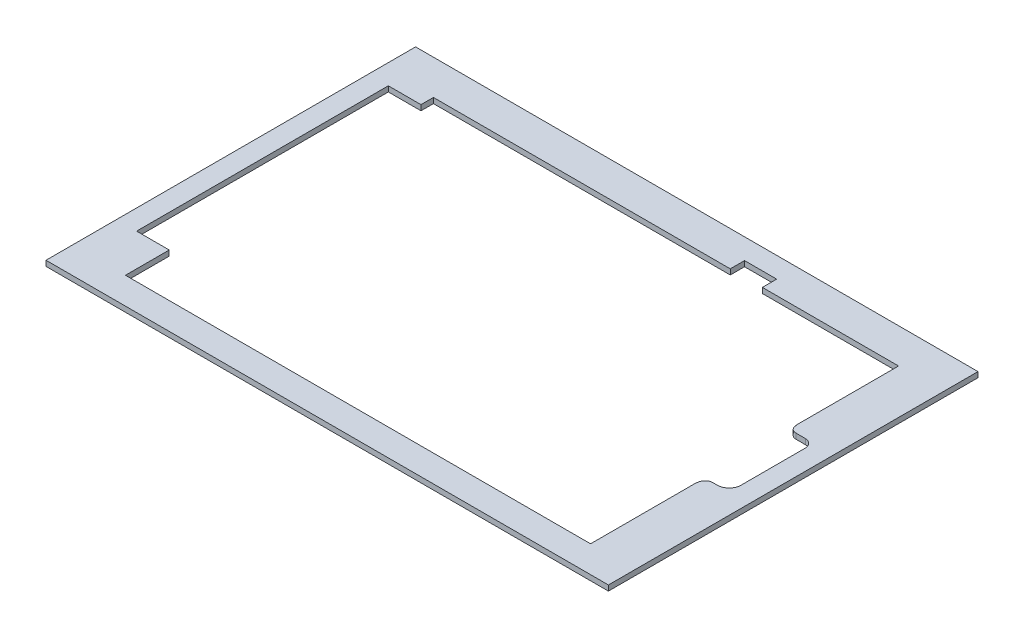
ISO-10303-21;
HEADER;
FILE_DESCRIPTION(('STEP AP214'),'2;1');
FILE_NAME('part.step','',(''),(''),'','','');
FILE_SCHEMA(('AUTOMOTIVE_DESIGN { 1 0 10303 214 1 1 1 1 }'));
ENDSEC;
DATA;
#1=APPLICATION_CONTEXT('core data for automotive mechanical design processes');
#2=APPLICATION_PROTOCOL_DEFINITION('international standard','automotive_design',2000,#1);
#3=PRODUCT_CONTEXT('',#1,'mechanical');
#4=PRODUCT('Part','Part','',(#3));
#5=PRODUCT_RELATED_PRODUCT_CATEGORY('part','',(#4));
#6=PRODUCT_DEFINITION_FORMATION('','',#4);
#7=PRODUCT_DEFINITION_CONTEXT('part definition',#1,'design');
#8=PRODUCT_DEFINITION('design','',#6,#7);
#9=PRODUCT_DEFINITION_SHAPE('','',#8);
#10=(LENGTH_UNIT() NAMED_UNIT(*) SI_UNIT(.MILLI.,.METRE.));
#11=(NAMED_UNIT(*) PLANE_ANGLE_UNIT() SI_UNIT($,.RADIAN.));
#12=(NAMED_UNIT(*) SI_UNIT($,.STERADIAN.) SOLID_ANGLE_UNIT());
#13=UNCERTAINTY_MEASURE_WITH_UNIT(LENGTH_MEASURE(1.E-05),#10,'distance_accuracy_value','');
#14=(GEOMETRIC_REPRESENTATION_CONTEXT(3) GLOBAL_UNCERTAINTY_ASSIGNED_CONTEXT((#13)) GLOBAL_UNIT_ASSIGNED_CONTEXT((#10,
#11,#12)) REPRESENTATION_CONTEXT('',''));
#15=CARTESIAN_POINT('',(0.,0.,0.));
#16=DIRECTION('',(0.,0.,1.));
#17=DIRECTION('',(1.,0.,0.));
#18=AXIS2_PLACEMENT_3D('',#15,#16,#17);
#19=CARTESIAN_POINT('',(44.18,5.,-27.9875));
#20=DIRECTION('',(1.,0.,0.));
#21=DIRECTION('',(0.,0.,-1.));
#22=AXIS2_PLACEMENT_3D('',#19,#20,#21);
#23=PLANE('',#22);
#24=DIRECTION('',(0.,0.,1.));
#25=VECTOR('',#24,1.);
#26=CARTESIAN_POINT('',(44.18,1.,-27.9875));
#27=LINE('',#26,#25);
#28=CARTESIAN_POINT('',(44.18,1.,-27.9875));
#29=VERTEX_POINT('',#28);
#30=CARTESIAN_POINT('',(44.18,1.,-8.73421592894432));
#31=VERTEX_POINT('',#30);
#32=EDGE_CURVE('E374',#29,#31,#27,.T.);
#33=ORIENTED_EDGE('',*,*,#32,.F.);
#34=DIRECTION('',(0.,-1.,0.));
#35=VECTOR('',#34,1.);
#36=CARTESIAN_POINT('',(44.18,5.,-27.9875));
#37=LINE('',#36,#35);
#38=CARTESIAN_POINT('',(44.18,0.,-27.9875));
#39=VERTEX_POINT('',#38);
#40=EDGE_CURVE('E313',#29,#39,#37,.T.);
#41=ORIENTED_EDGE('',*,*,#40,.T.);
#42=DIRECTION('',(0.,0.,1.));
#43=VECTOR('',#42,1.);
#44=CARTESIAN_POINT('',(44.18,0.,-27.9875));
#45=LINE('',#44,#43);
#46=CARTESIAN_POINT('',(44.18,0.,-8.73421592894432));
#47=VERTEX_POINT('',#46);
#48=EDGE_CURVE('E285',#39,#47,#45,.T.);
#49=ORIENTED_EDGE('',*,*,#48,.T.);
#50=DIRECTION('',(0.,-1.,0.));
#51=VECTOR('',#50,1.);
#52=CARTESIAN_POINT('',(44.18,5.,-8.73421592894432));
#53=LINE('',#52,#51);
#54=EDGE_CURVE('E436',#31,#47,#53,.T.);
#55=ORIENTED_EDGE('',*,*,#54,.F.);
#56=EDGE_LOOP('',(#33,#41,#49,#55));
#57=FACE_BOUND('',#56,.T.);
#58=ADVANCED_FACE('F44',(#57),#23,.F.);
#59=CARTESIAN_POINT('',(-52.5,5.,34.5));
#60=DIRECTION('',(1.,0.,0.));
#61=DIRECTION('',(0.,0.,-1.));
#62=AXIS2_PLACEMENT_3D('',#59,#60,#61);
#63=PLANE('',#62);
#64=DIRECTION('',(0.,0.,1.));
#65=VECTOR('',#64,1.);
#66=CARTESIAN_POINT('',(-52.5,1.,-34.5));
#67=LINE('',#66,#65);
#68=CARTESIAN_POINT('',(-52.5,1.,-34.5));
#69=VERTEX_POINT('',#68);
#70=CARTESIAN_POINT('',(-52.5,1.,34.5));
#71=VERTEX_POINT('',#70);
#72=EDGE_CURVE('E217',#69,#71,#67,.T.);
#73=ORIENTED_EDGE('',*,*,#72,.F.);
#74=DIRECTION('',(0.,-1.,0.));
#75=VECTOR('',#74,1.);
#76=CARTESIAN_POINT('',(-52.5,5.,-34.5));
#77=LINE('',#76,#75);
#78=CARTESIAN_POINT('',(-52.5,0.,-34.5));
#79=VERTEX_POINT('',#78);
#80=EDGE_CURVE('E227',#69,#79,#77,.T.);
#81=ORIENTED_EDGE('',*,*,#80,.T.);
#82=DIRECTION('',(0.,0.,1.));
#83=VECTOR('',#82,1.);
#84=CARTESIAN_POINT('',(-52.5,0.,34.5));
#85=LINE('',#84,#83);
#86=CARTESIAN_POINT('',(-52.5,0.,34.5));
#87=VERTEX_POINT('',#86);
#88=EDGE_CURVE('E309',#79,#87,#85,.T.);
#89=ORIENTED_EDGE('',*,*,#88,.T.);
#90=DIRECTION('',(0.,-1.,0.));
#91=VECTOR('',#90,1.);
#92=CARTESIAN_POINT('',(-52.5,5.,34.5));
#93=LINE('',#92,#91);
#94=EDGE_CURVE('E229',#71,#87,#93,.T.);
#95=ORIENTED_EDGE('',*,*,#94,.F.);
#96=EDGE_LOOP('',(#73,#81,#89,#95));
#97=FACE_BOUND('',#96,.T.);
#98=ADVANCED_FACE('F46',(#97),#63,.F.);
#99=CARTESIAN_POINT('',(52.5,5.,34.5));
#100=DIRECTION('',(0.,0.,-1.));
#101=DIRECTION('',(-1.,0.,0.));
#102=AXIS2_PLACEMENT_3D('',#99,#100,#101);
#103=PLANE('',#102);
#104=DIRECTION('',(1.,0.,0.));
#105=VECTOR('',#104,1.);
#106=CARTESIAN_POINT('',(-52.5,1.,34.5));
#107=LINE('',#106,#105);
#108=CARTESIAN_POINT('',(52.5,1.,34.5));
#109=VERTEX_POINT('',#108);
#110=EDGE_CURVE('E231',#71,#109,#107,.T.);
#111=ORIENTED_EDGE('',*,*,#110,.F.);
#112=ORIENTED_EDGE('',*,*,#94,.T.);
#113=DIRECTION('',(1.,0.,0.));
#114=VECTOR('',#113,1.);
#115=CARTESIAN_POINT('',(52.5,0.,34.5));
#116=LINE('',#115,#114);
#117=CARTESIAN_POINT('',(52.5,0.,34.5));
#118=VERTEX_POINT('',#117);
#119=EDGE_CURVE('E320',#87,#118,#116,.T.);
#120=ORIENTED_EDGE('',*,*,#119,.T.);
#121=DIRECTION('',(0.,-1.,0.));
#122=VECTOR('',#121,1.);
#123=CARTESIAN_POINT('',(52.5,5.,34.5));
#124=LINE('',#123,#122);
#125=EDGE_CURVE('E242',#109,#118,#124,.T.);
#126=ORIENTED_EDGE('',*,*,#125,.F.);
#127=EDGE_LOOP('',(#111,#112,#120,#126));
#128=FACE_BOUND('',#127,.T.);
#129=ADVANCED_FACE('F331',(#128),#103,.F.);
#130=CARTESIAN_POINT('',(52.5,5.,34.5));
#131=DIRECTION('',(-1.,0.,0.));
#132=DIRECTION('',(0.,0.,1.));
#133=AXIS2_PLACEMENT_3D('',#130,#131,#132);
#134=PLANE('',#133);
#135=DIRECTION('',(0.,0.,-1.));
#136=VECTOR('',#135,1.);
#137=CARTESIAN_POINT('',(52.5,1.,34.5));
#138=LINE('',#137,#136);
#139=CARTESIAN_POINT('',(52.5,1.,-34.5));
#140=VERTEX_POINT('',#139);
#141=EDGE_CURVE('E60',#109,#140,#138,.T.);
#142=ORIENTED_EDGE('',*,*,#141,.F.);
#143=ORIENTED_EDGE('',*,*,#125,.T.);
#144=DIRECTION('',(0.,0.,-1.));
#145=VECTOR('',#144,1.);
#146=CARTESIAN_POINT('',(52.5,0.,34.5));
#147=LINE('',#146,#145);
#148=CARTESIAN_POINT('',(52.5,0.,-34.5));
#149=VERTEX_POINT('',#148);
#150=EDGE_CURVE('E244',#118,#149,#147,.T.);
#151=ORIENTED_EDGE('',*,*,#150,.T.);
#152=DIRECTION('',(0.,-1.,0.));
#153=VECTOR('',#152,1.);
#154=CARTESIAN_POINT('',(52.5,5.,-34.5));
#155=LINE('',#154,#153);
#156=EDGE_CURVE('E238',#140,#149,#155,.T.);
#157=ORIENTED_EDGE('',*,*,#156,.F.);
#158=EDGE_LOOP('',(#142,#143,#151,#157));
#159=FACE_BOUND('',#158,.T.);
#160=ADVANCED_FACE('F327',(#159),#134,.F.);
#161=CARTESIAN_POINT('',(52.5,5.,-34.5));
#162=DIRECTION('',(0.,0.,1.));
#163=DIRECTION('',(1.,0.,0.));
#164=AXIS2_PLACEMENT_3D('',#161,#162,#163);
#165=PLANE('',#164);
#166=DIRECTION('',(-1.,0.,0.));
#167=VECTOR('',#166,1.);
#168=CARTESIAN_POINT('',(52.5,1.,-34.5));
#169=LINE('',#168,#167);
#170=EDGE_CURVE('E214',#140,#69,#169,.T.);
#171=ORIENTED_EDGE('',*,*,#170,.F.);
#172=ORIENTED_EDGE('',*,*,#156,.T.);
#173=DIRECTION('',(-1.,0.,0.));
#174=VECTOR('',#173,1.);
#175=CARTESIAN_POINT('',(52.5,0.,-34.5));
#176=LINE('',#175,#174);
#177=EDGE_CURVE('E235',#149,#79,#176,.T.);
#178=ORIENTED_EDGE('',*,*,#177,.T.);
#179=ORIENTED_EDGE('',*,*,#80,.F.);
#180=EDGE_LOOP('',(#171,#172,#178,#179));
#181=FACE_BOUND('',#180,.T.);
#182=ADVANCED_FACE('F233',(#181),#165,.F.);
#183=CARTESIAN_POINT('',(-42.656,5.,29.5115));
#184=DIRECTION('',(-1.,0.,0.));
#185=DIRECTION('',(0.,0.,1.));
#186=AXIS2_PLACEMENT_3D('',#183,#184,#185);
#187=PLANE('',#186);
#188=DIRECTION('',(0.,0.,-1.));
#189=VECTOR('',#188,1.);
#190=CARTESIAN_POINT('',(-42.656,1.,29.5115));
#191=LINE('',#190,#189);
#192=CARTESIAN_POINT('',(-42.656,1.,29.5115));
#193=VERTEX_POINT('',#192);
#194=CARTESIAN_POINT('',(-42.656,1.,21.3375));
#195=VERTEX_POINT('',#194);
#196=EDGE_CURVE('E348',#193,#195,#191,.T.);
#197=ORIENTED_EDGE('',*,*,#196,.F.);
#198=DIRECTION('',(0.,-1.,0.));
#199=VECTOR('',#198,1.);
#200=CARTESIAN_POINT('',(-42.656,5.,29.5115));
#201=LINE('',#200,#199);
#202=CARTESIAN_POINT('',(-42.656,0.,29.5115));
#203=VERTEX_POINT('',#202);
#204=EDGE_CURVE('E306',#193,#203,#201,.T.);
#205=ORIENTED_EDGE('',*,*,#204,.T.);
#206=DIRECTION('',(0.,0.,-1.));
#207=VECTOR('',#206,1.);
#208=CARTESIAN_POINT('',(-42.656,0.,29.5115));
#209=LINE('',#208,#207);
#210=CARTESIAN_POINT('',(-42.656,0.,21.3375));
#211=VERTEX_POINT('',#210);
#212=EDGE_CURVE('E288',#203,#211,#209,.T.);
#213=ORIENTED_EDGE('',*,*,#212,.T.);
#214=DIRECTION('',(0.,1.,0.));
#215=VECTOR('',#214,1.);
#216=CARTESIAN_POINT('',(-42.656,5.,21.3375));
#217=LINE('',#216,#215);
#218=EDGE_CURVE('E256',#211,#195,#217,.T.);
#219=ORIENTED_EDGE('',*,*,#218,.T.);
#220=EDGE_LOOP('',(#197,#205,#213,#219));
#221=FACE_BOUND('',#220,.T.);
#222=ADVANCED_FACE('F575',(#221),#187,.F.);
#223=CARTESIAN_POINT('',(-42.656,1.,-25.6625));
#224=VERTEX_POINT('',#223);
#225=CARTESIAN_POINT('',(-42.656,1.,-27.9875));
#226=VERTEX_POINT('',#225);
#227=EDGE_CURVE('E352',#224,#226,#191,.T.);
#228=ORIENTED_EDGE('',*,*,#227,.F.);
#229=DIRECTION('',(0.,-1.,0.));
#230=VECTOR('',#229,1.);
#231=CARTESIAN_POINT('',(-42.656,5.,-25.6625));
#232=LINE('',#231,#230);
#233=CARTESIAN_POINT('',(-42.656,0.,-25.6625));
#234=VERTEX_POINT('',#233);
#235=EDGE_CURVE('E252',#224,#234,#232,.T.);
#236=ORIENTED_EDGE('',*,*,#235,.T.);
#237=CARTESIAN_POINT('',(-42.656,0.,-27.9875));
#238=VERTEX_POINT('',#237);
#239=EDGE_CURVE('E295',#234,#238,#209,.T.);
#240=ORIENTED_EDGE('',*,*,#239,.T.);
#241=DIRECTION('',(0.,-1.,0.));
#242=VECTOR('',#241,1.);
#243=CARTESIAN_POINT('',(-42.656,5.,-27.9875));
#244=LINE('',#243,#242);
#245=EDGE_CURVE('E305',#226,#238,#244,.T.);
#246=ORIENTED_EDGE('',*,*,#245,.F.);
#247=EDGE_LOOP('',(#228,#236,#240,#246));
#248=FACE_BOUND('',#247,.T.);
#249=ADVANCED_FACE('F516',(#248),#187,.F.);
#250=CARTESIAN_POINT('',(44.18,5.,29.5115));
#251=DIRECTION('',(0.,0.,1.));
#252=DIRECTION('',(1.,0.,0.));
#253=AXIS2_PLACEMENT_3D('',#250,#251,#252);
#254=PLANE('',#253);
#255=DIRECTION('',(-1.,0.,0.));
#256=VECTOR('',#255,1.);
#257=CARTESIAN_POINT('',(44.18,1.,29.5115));
#258=LINE('',#257,#256);
#259=CARTESIAN_POINT('',(44.18,1.,29.5115));
#260=VERTEX_POINT('',#259);
#261=EDGE_CURVE('E345',#260,#193,#258,.T.);
#262=ORIENTED_EDGE('',*,*,#261,.F.);
#263=DIRECTION('',(0.,-1.,0.));
#264=VECTOR('',#263,1.);
#265=CARTESIAN_POINT('',(44.18,5.,29.5115));
#266=LINE('',#265,#264);
#267=CARTESIAN_POINT('',(44.18,0.,29.5115));
#268=VERTEX_POINT('',#267);
#269=EDGE_CURVE('E310',#260,#268,#266,.T.);
#270=ORIENTED_EDGE('',*,*,#269,.T.);
#271=DIRECTION('',(-1.,0.,0.));
#272=VECTOR('',#271,1.);
#273=CARTESIAN_POINT('',(44.18,0.,29.5115));
#274=LINE('',#273,#272);
#275=EDGE_CURVE('E301',#268,#203,#274,.T.);
#276=ORIENTED_EDGE('',*,*,#275,.T.);
#277=ORIENTED_EDGE('',*,*,#204,.F.);
#278=EDGE_LOOP('',(#262,#270,#276,#277));
#279=FACE_BOUND('',#278,.T.);
#280=ADVANCED_FACE('F572',(#279),#254,.F.);
#281=DIRECTION('',(0.,0.,1.));
#282=VECTOR('',#281,1.);
#283=CARTESIAN_POINT('',(44.18,1.,-27.9875));
#284=LINE('',#283,#282);
#285=CARTESIAN_POINT('',(44.18,1.,9.66933210238182));
#286=VERTEX_POINT('',#285);
#287=EDGE_CURVE('E342',#286,#260,#284,.T.);
#288=ORIENTED_EDGE('',*,*,#287,.F.);
#289=DIRECTION('',(0.,-1.,0.));
#290=VECTOR('',#289,1.);
#291=CARTESIAN_POINT('',(44.18,5.,9.66933210238182));
#292=LINE('',#291,#290);
#293=CARTESIAN_POINT('',(44.18,0.,9.66933210238182));
#294=VERTEX_POINT('',#293);
#295=EDGE_CURVE('E439',#286,#294,#292,.T.);
#296=ORIENTED_EDGE('',*,*,#295,.T.);
#297=EDGE_CURVE('E293',#294,#268,#45,.T.);
#298=ORIENTED_EDGE('',*,*,#297,.T.);
#299=ORIENTED_EDGE('',*,*,#269,.F.);
#300=EDGE_LOOP('',(#288,#296,#298,#299));
#301=FACE_BOUND('',#300,.T.);
#302=ADVANCED_FACE('F565',(#301),#23,.F.);
#303=CARTESIAN_POINT('',(-42.656,5.,-27.9875));
#304=DIRECTION('',(0.,0.,-1.));
#305=DIRECTION('',(-1.,0.,0.));
#306=AXIS2_PLACEMENT_3D('',#303,#304,#305);
#307=PLANE('',#306);
#308=DIRECTION('',(1.,0.,0.));
#309=VECTOR('',#308,1.);
#310=CARTESIAN_POINT('',(-42.656,1.,-27.9875));
#311=LINE('',#310,#309);
#312=CARTESIAN_POINT('',(12.760001666667,1.,-27.9875));
#313=VERTEX_POINT('',#312);
#314=EDGE_CURVE('E363',#226,#313,#311,.T.);
#315=ORIENTED_EDGE('',*,*,#314,.F.);
#316=ORIENTED_EDGE('',*,*,#245,.T.);
#317=DIRECTION('',(1.,0.,0.));
#318=VECTOR('',#317,1.);
#319=CARTESIAN_POINT('',(-42.656,0.,-27.9875));
#320=LINE('',#319,#318);
#321=CARTESIAN_POINT('',(12.760001666667,0.,-27.9875));
#322=VERTEX_POINT('',#321);
#323=EDGE_CURVE('E287',#238,#322,#320,.T.);
#324=ORIENTED_EDGE('',*,*,#323,.T.);
#325=DIRECTION('',(0.,1.,0.));
#326=VECTOR('',#325,1.);
#327=CARTESIAN_POINT('',(12.760001666667,5.,-27.9875));
#328=LINE('',#327,#326);
#329=EDGE_CURVE('E260',#322,#313,#328,.T.);
#330=ORIENTED_EDGE('',*,*,#329,.T.);
#331=EDGE_LOOP('',(#315,#316,#324,#330));
#332=FACE_BOUND('',#331,.T.);
#333=ADVANCED_FACE('F597',(#332),#307,.F.);
#334=CARTESIAN_POINT('',(18.760001666667,1.,-27.9875));
#335=VERTEX_POINT('',#334);
#336=EDGE_CURVE('E274',#335,#29,#311,.T.);
#337=ORIENTED_EDGE('',*,*,#336,.F.);
#338=DIRECTION('',(0.,-1.,0.));
#339=VECTOR('',#338,1.);
#340=CARTESIAN_POINT('',(18.760001666667,5.,-27.9875));
#341=LINE('',#340,#339);
#342=CARTESIAN_POINT('',(18.760001666667,0.,-27.9875));
#343=VERTEX_POINT('',#342);
#344=EDGE_CURVE('E53',#335,#343,#341,.T.);
#345=ORIENTED_EDGE('',*,*,#344,.T.);
#346=EDGE_CURVE('E272',#343,#39,#320,.T.);
#347=ORIENTED_EDGE('',*,*,#346,.T.);
#348=ORIENTED_EDGE('',*,*,#40,.F.);
#349=EDGE_LOOP('',(#337,#345,#347,#348));
#350=FACE_BOUND('',#349,.T.);
#351=ADVANCED_FACE('F270',(#350),#307,.F.);
#352=CARTESIAN_POINT('',(0.,5.,8.1994127469508));
#353=DIRECTION('',(0.,0.,1.));
#354=DIRECTION('',(1.,0.,0.));
#355=AXIS2_PLACEMENT_3D('',#352,#353,#354);
#356=PLANE('',#355);
#357=DIRECTION('',(-1.,0.,0.));
#358=VECTOR('',#357,1.);
#359=CARTESIAN_POINT('',(0.,1.,8.1994127469508));
#360=LINE('',#359,#358);
#361=CARTESIAN_POINT('',(46.5505872530492,1.,8.1994127469508));
#362=VERTEX_POINT('',#361);
#363=CARTESIAN_POINT('',(45.719919355431,1.,8.1994127469508));
#364=VERTEX_POINT('',#363);
#365=EDGE_CURVE('E67',#362,#364,#360,.T.);
#366=ORIENTED_EDGE('',*,*,#365,.F.);
#367=DIRECTION('',(0.,-1.,0.));
#368=VECTOR('',#367,1.);
#369=CARTESIAN_POINT('',(46.5505872530492,5.,8.1994127469508));
#370=LINE('',#369,#368);
#371=CARTESIAN_POINT('',(46.5505872530492,0.,8.1994127469508));
#372=VERTEX_POINT('',#371);
#373=EDGE_CURVE('E417',#362,#372,#370,.T.);
#374=ORIENTED_EDGE('',*,*,#373,.T.);
#375=DIRECTION('',(-1.,0.,0.));
#376=VECTOR('',#375,1.);
#377=CARTESIAN_POINT('',(0.,0.,8.1994127469508));
#378=LINE('',#377,#376);
#379=CARTESIAN_POINT('',(45.719919355431,0.,8.1994127469508));
#380=VERTEX_POINT('',#379);
#381=EDGE_CURVE('E381',#372,#380,#378,.T.);
#382=ORIENTED_EDGE('',*,*,#381,.T.);
#383=DIRECTION('',(0.,-1.,0.));
#384=VECTOR('',#383,1.);
#385=CARTESIAN_POINT('',(45.719919355431,5.,8.1994127469508));
#386=LINE('',#385,#384);
#387=EDGE_CURVE('E416',#364,#380,#386,.T.);
#388=ORIENTED_EDGE('',*,*,#387,.F.);
#389=EDGE_LOOP('',(#366,#374,#382,#388));
#390=FACE_BOUND('',#389,.T.);
#391=ADVANCED_FACE('F551',(#390),#356,.F.);
#392=CARTESIAN_POINT('',(46.5505872530492,5.,6.));
#393=DIRECTION('',(0.,-1.,0.));
#394=DIRECTION('',(0.,0.,-1.));
#395=AXIS2_PLACEMENT_3D('',#392,#393,#394);
#396=CYLINDRICAL_SURFACE('',#395,2.1994127469508);
#397=CARTESIAN_POINT('',(46.5505872530492,1.,6.));
#398=DIRECTION('',(0.,1.,0.));
#399=DIRECTION('',(0.,0.,1.));
#400=AXIS2_PLACEMENT_3D('',#397,#398,#399);
#401=CIRCLE('',#400,2.1994127469508);
#402=CARTESIAN_POINT('',(48.75,1.,6.));
#403=VERTEX_POINT('',#402);
#404=EDGE_CURVE('E351',#403,#362,#401,.F.);
#405=ORIENTED_EDGE('',*,*,#404,.F.);
#406=DIRECTION('',(0.,-1.,0.));
#407=VECTOR('',#406,1.);
#408=CARTESIAN_POINT('',(48.75,5.,6.));
#409=LINE('',#408,#407);
#410=CARTESIAN_POINT('',(48.75,0.,6.));
#411=VERTEX_POINT('',#410);
#412=EDGE_CURVE('E421',#403,#411,#409,.T.);
#413=ORIENTED_EDGE('',*,*,#412,.T.);
#414=CARTESIAN_POINT('',(46.5505872530492,0.,6.));
#415=DIRECTION('',(0.,-1.,0.));
#416=DIRECTION('',(0.,0.,-1.));
#417=AXIS2_PLACEMENT_3D('',#414,#415,#416);
#418=CIRCLE('',#417,2.1994127469508);
#419=EDGE_CURVE('E412',#411,#372,#418,.T.);
#420=ORIENTED_EDGE('',*,*,#419,.T.);
#421=ORIENTED_EDGE('',*,*,#373,.F.);
#422=EDGE_LOOP('',(#405,#413,#420,#421));
#423=FACE_BOUND('',#422,.T.);
#424=ADVANCED_FACE('F546',(#423),#396,.F.);
#425=CARTESIAN_POINT('',(48.75,5.,0.));
#426=DIRECTION('',(-1.,0.,0.));
#427=DIRECTION('',(0.,0.,1.));
#428=AXIS2_PLACEMENT_3D('',#425,#426,#427);
#429=PLANE('',#428);
#430=ORIENTED_EDGE('',*,*,#412,.F.);
#431=DIRECTION('',(0.,0.,-1.));
#432=VECTOR('',#431,1.);
#433=CARTESIAN_POINT('',(48.75,1.,0.));
#434=LINE('',#433,#432);
#435=CARTESIAN_POINT('',(48.75,1.,-6.));
#436=VERTEX_POINT('',#435);
#437=EDGE_CURVE('E355',#403,#436,#434,.T.);
#438=ORIENTED_EDGE('',*,*,#437,.T.);
#439=DIRECTION('',(0.,-1.,0.));
#440=VECTOR('',#439,1.);
#441=CARTESIAN_POINT('',(48.75,5.,-6.));
#442=LINE('',#441,#440);
#443=CARTESIAN_POINT('',(48.75,0.,-6.));
#444=VERTEX_POINT('',#443);
#445=EDGE_CURVE('E424',#436,#444,#442,.T.);
#446=ORIENTED_EDGE('',*,*,#445,.T.);
#447=DIRECTION('',(0.,0.,-1.));
#448=VECTOR('',#447,1.);
#449=CARTESIAN_POINT('',(48.75,0.,0.));
#450=LINE('',#449,#448);
#451=EDGE_CURVE('E408',#411,#444,#450,.T.);
#452=ORIENTED_EDGE('',*,*,#451,.F.);
#453=EDGE_LOOP('',(#430,#438,#446,#452));
#454=FACE_BOUND('',#453,.T.);
#455=ADVANCED_FACE('F542',(#454),#429,.T.);
#456=CARTESIAN_POINT('',(47.1880408786103,5.,-6.));
#457=DIRECTION('',(0.,-1.,0.));
#458=DIRECTION('',(0.,0.,-1.));
#459=AXIS2_PLACEMENT_3D('',#456,#457,#458);
#460=CYLINDRICAL_SURFACE('',#459,1.56195912138972);
#461=ORIENTED_EDGE('',*,*,#445,.F.);
#462=CARTESIAN_POINT('',(47.1880408786103,1.,-6.));
#463=DIRECTION('',(0.,1.,0.));
#464=DIRECTION('',(0.,0.,1.));
#465=AXIS2_PLACEMENT_3D('',#462,#463,#464);
#466=CIRCLE('',#465,1.56195912138972);
#467=CARTESIAN_POINT('',(47.1880408786103,1.,-7.56195912138971));
#468=VERTEX_POINT('',#467);
#469=EDGE_CURVE('E359',#436,#468,#466,.T.);
#470=ORIENTED_EDGE('',*,*,#469,.T.);
#471=DIRECTION('',(0.,-1.,0.));
#472=VECTOR('',#471,1.);
#473=CARTESIAN_POINT('',(47.1880408786103,5.,-7.56195912138971));
#474=LINE('',#473,#472);
#475=CARTESIAN_POINT('',(47.1880408786103,0.,-7.56195912138971));
#476=VERTEX_POINT('',#475);
#477=EDGE_CURVE('E427',#468,#476,#474,.T.);
#478=ORIENTED_EDGE('',*,*,#477,.T.);
#479=CARTESIAN_POINT('',(47.1880408786103,0.,-6.));
#480=DIRECTION('',(0.,-1.,0.));
#481=DIRECTION('',(0.,0.,-1.));
#482=AXIS2_PLACEMENT_3D('',#479,#480,#481);
#483=CIRCLE('',#482,1.56195912138972);
#484=EDGE_CURVE('E404',#444,#476,#483,.F.);
#485=ORIENTED_EDGE('',*,*,#484,.F.);
#486=EDGE_LOOP('',(#461,#470,#478,#485));
#487=FACE_BOUND('',#486,.T.);
#488=ADVANCED_FACE('F538',(#487),#460,.F.);
#489=CARTESIAN_POINT('',(0.,5.,-7.56195912138976));
#490=DIRECTION('',(0.,0.,1.));
#491=DIRECTION('',(1.,0.,0.));
#492=AXIS2_PLACEMENT_3D('',#489,#490,#491);
#493=PLANE('',#492);
#494=ORIENTED_EDGE('',*,*,#477,.F.);
#495=DIRECTION('',(-1.,0.,0.));
#496=VECTOR('',#495,1.);
#497=CARTESIAN_POINT('',(0.,1.,-7.56195912138976));
#498=LINE('',#497,#496);
#499=CARTESIAN_POINT('',(45.4222568075546,1.,-7.56195912138971));
#500=VERTEX_POINT('',#499);
#501=EDGE_CURVE('E366',#468,#500,#498,.T.);
#502=ORIENTED_EDGE('',*,*,#501,.T.);
#503=DIRECTION('',(0.,-1.,0.));
#504=VECTOR('',#503,1.);
#505=CARTESIAN_POINT('',(45.4222568075546,5.,-7.56195912138971));
#506=LINE('',#505,#504);
#507=CARTESIAN_POINT('',(45.4222568075546,0.,-7.56195912138971));
#508=VERTEX_POINT('',#507);
#509=EDGE_CURVE('E430',#500,#508,#506,.T.);
#510=ORIENTED_EDGE('',*,*,#509,.T.);
#511=DIRECTION('',(-1.,0.,0.));
#512=VECTOR('',#511,1.);
#513=CARTESIAN_POINT('',(0.,0.,-7.56195912138976));
#514=LINE('',#513,#512);
#515=EDGE_CURVE('E400',#476,#508,#514,.T.);
#516=ORIENTED_EDGE('',*,*,#515,.F.);
#517=EDGE_LOOP('',(#494,#502,#510,#516));
#518=FACE_BOUND('',#517,.T.);
#519=ADVANCED_FACE('F534',(#518),#493,.T.);
#520=CARTESIAN_POINT('',(45.4222568075546,5.,-8.73421592894432));
#521=DIRECTION('',(0.,-1.,0.));
#522=DIRECTION('',(0.,0.,-1.));
#523=AXIS2_PLACEMENT_3D('',#520,#521,#522);
#524=CYLINDRICAL_SURFACE('',#523,1.17225680755461);
#525=ORIENTED_EDGE('',*,*,#509,.F.);
#526=CARTESIAN_POINT('',(45.4222568075546,1.,-8.73421592894432));
#527=DIRECTION('',(0.,1.,0.));
#528=DIRECTION('',(0.,0.,1.));
#529=AXIS2_PLACEMENT_3D('',#526,#527,#528);
#530=CIRCLE('',#529,1.17225680755461);
#531=CARTESIAN_POINT('',(44.25,1.,-8.73421592894432));
#532=VERTEX_POINT('',#531);
#533=EDGE_CURVE('E370',#500,#532,#530,.F.);
#534=ORIENTED_EDGE('',*,*,#533,.T.);
#535=DIRECTION('',(0.,-1.,0.));
#536=VECTOR('',#535,1.);
#537=CARTESIAN_POINT('',(44.25,5.,-8.73421592894432));
#538=LINE('',#537,#536);
#539=CARTESIAN_POINT('',(44.25,0.,-8.73421592894432));
#540=VERTEX_POINT('',#539);
#541=EDGE_CURVE('E433',#532,#540,#538,.T.);
#542=ORIENTED_EDGE('',*,*,#541,.T.);
#543=CARTESIAN_POINT('',(45.4222568075546,0.,-8.73421592894432));
#544=DIRECTION('',(0.,-1.,0.));
#545=DIRECTION('',(0.,0.,-1.));
#546=AXIS2_PLACEMENT_3D('',#543,#544,#545);
#547=CIRCLE('',#546,1.17225680755461);
#548=EDGE_CURVE('E396',#508,#540,#547,.T.);
#549=ORIENTED_EDGE('',*,*,#548,.F.);
#550=EDGE_LOOP('',(#525,#534,#542,#549));
#551=FACE_BOUND('',#550,.T.);
#552=ADVANCED_FACE('F531',(#551),#524,.T.);
#553=CARTESIAN_POINT('',(0.,5.,-8.73421592894432));
#554=DIRECTION('',(0.,0.,1.));
#555=DIRECTION('',(1.,0.,0.));
#556=AXIS2_PLACEMENT_3D('',#553,#554,#555);
#557=PLANE('',#556);
#558=ORIENTED_EDGE('',*,*,#541,.F.);
#559=DIRECTION('',(-1.,0.,0.));
#560=VECTOR('',#559,1.);
#561=CARTESIAN_POINT('',(0.,1.,-8.73421592894432));
#562=LINE('',#561,#560);
#563=EDGE_CURVE('E377',#532,#31,#562,.T.);
#564=ORIENTED_EDGE('',*,*,#563,.T.);
#565=ORIENTED_EDGE('',*,*,#54,.T.);
#566=DIRECTION('',(-1.,0.,0.));
#567=VECTOR('',#566,1.);
#568=CARTESIAN_POINT('',(0.,0.,-8.73421592894432));
#569=LINE('',#568,#567);
#570=EDGE_CURVE('E393',#540,#47,#569,.T.);
#571=ORIENTED_EDGE('',*,*,#570,.F.);
#572=EDGE_LOOP('',(#558,#564,#565,#571));
#573=FACE_BOUND('',#572,.T.);
#574=ADVANCED_FACE('F526',(#573),#557,.T.);
#575=CARTESIAN_POINT('',(0.,5.,9.66933210238182));
#576=DIRECTION('',(0.,0.,1.));
#577=DIRECTION('',(1.,0.,0.));
#578=AXIS2_PLACEMENT_3D('',#575,#576,#577);
#579=PLANE('',#578);
#580=DIRECTION('',(-1.,0.,0.));
#581=VECTOR('',#580,1.);
#582=CARTESIAN_POINT('',(0.,1.,9.66933210238182));
#583=LINE('',#582,#581);
#584=CARTESIAN_POINT('',(44.25,1.,9.66933210238182));
#585=VERTEX_POINT('',#584);
#586=EDGE_CURVE('E335',#585,#286,#583,.T.);
#587=ORIENTED_EDGE('',*,*,#586,.F.);
#588=DIRECTION('',(0.,-1.,0.));
#589=VECTOR('',#588,1.);
#590=CARTESIAN_POINT('',(44.25,5.,9.66933210238182));
#591=LINE('',#590,#589);
#592=CARTESIAN_POINT('',(44.25,0.,9.66933210238182));
#593=VERTEX_POINT('',#592);
#594=EDGE_CURVE('E442',#585,#593,#591,.T.);
#595=ORIENTED_EDGE('',*,*,#594,.T.);
#596=DIRECTION('',(-1.,0.,0.));
#597=VECTOR('',#596,1.);
#598=CARTESIAN_POINT('',(0.,0.,9.66933210238182));
#599=LINE('',#598,#597);
#600=EDGE_CURVE('E389',#593,#294,#599,.T.);
#601=ORIENTED_EDGE('',*,*,#600,.T.);
#602=ORIENTED_EDGE('',*,*,#295,.F.);
#603=EDGE_LOOP('',(#587,#595,#601,#602));
#604=FACE_BOUND('',#603,.T.);
#605=ADVANCED_FACE('F561',(#604),#579,.F.);
#606=CARTESIAN_POINT('',(45.719919355431,5.,9.66933210238182));
#607=DIRECTION('',(0.,-1.,0.));
#608=DIRECTION('',(0.,0.,-1.));
#609=AXIS2_PLACEMENT_3D('',#606,#607,#608);
#610=CYLINDRICAL_SURFACE('',#609,1.46991935543102);
#611=CARTESIAN_POINT('',(45.719919355431,1.,9.66933210238182));
#612=DIRECTION('',(0.,1.,0.));
#613=DIRECTION('',(0.,0.,1.));
#614=AXIS2_PLACEMENT_3D('',#611,#612,#613);
#615=CIRCLE('',#614,1.46991935543102);
#616=EDGE_CURVE('E11',#364,#585,#615,.T.);
#617=ORIENTED_EDGE('',*,*,#616,.F.);
#618=ORIENTED_EDGE('',*,*,#387,.T.);
#619=CARTESIAN_POINT('',(45.719919355431,0.,9.66933210238182));
#620=DIRECTION('',(0.,-1.,0.));
#621=DIRECTION('',(0.,0.,-1.));
#622=AXIS2_PLACEMENT_3D('',#619,#620,#621);
#623=CIRCLE('',#622,1.46991935543102);
#624=EDGE_CURVE('E385',#380,#593,#623,.F.);
#625=ORIENTED_EDGE('',*,*,#624,.T.);
#626=ORIENTED_EDGE('',*,*,#594,.F.);
#627=EDGE_LOOP('',(#617,#618,#625,#626));
#628=FACE_BOUND('',#627,.T.);
#629=ADVANCED_FACE('F554',(#628),#610,.T.);
#630=CARTESIAN_POINT('',(0.,0.,0.));
#631=DIRECTION('',(0.,1.,0.));
#632=DIRECTION('',(0.,0.,1.));
#633=AXIS2_PLACEMENT_3D('',#630,#631,#632);
#634=PLANE('',#633);
#635=ORIENTED_EDGE('',*,*,#570,.T.);
#636=ORIENTED_EDGE('',*,*,#48,.F.);
#637=ORIENTED_EDGE('',*,*,#346,.F.);
#638=DIRECTION('',(0.,0.,1.));
#639=VECTOR('',#638,1.);
#640=CARTESIAN_POINT('',(18.760001666667,0.,0.));
#641=LINE('',#640,#639);
#642=CARTESIAN_POINT('',(18.760001666667,0.,-30.6525));
#643=VERTEX_POINT('',#642);
#644=EDGE_CURVE('E283',#643,#343,#641,.T.);
#645=ORIENTED_EDGE('',*,*,#644,.F.);
#646=DIRECTION('',(1.,0.,0.));
#647=VECTOR('',#646,1.);
#648=CARTESIAN_POINT('',(0.,0.,-30.6525));
#649=LINE('',#648,#647);
#650=CARTESIAN_POINT('',(12.760001666667,0.,-30.6525));
#651=VERTEX_POINT('',#650);
#652=EDGE_CURVE('E459',#651,#643,#649,.T.);
#653=ORIENTED_EDGE('',*,*,#652,.F.);
#654=DIRECTION('',(0.,0.,-1.));
#655=VECTOR('',#654,1.);
#656=CARTESIAN_POINT('',(12.760001666667,0.,0.));
#657=LINE('',#656,#655);
#658=EDGE_CURVE('E420',#322,#651,#657,.T.);
#659=ORIENTED_EDGE('',*,*,#658,.F.);
#660=ORIENTED_EDGE('',*,*,#323,.F.);
#661=ORIENTED_EDGE('',*,*,#239,.F.);
#662=DIRECTION('',(1.,0.,0.));
#663=VECTOR('',#662,1.);
#664=CARTESIAN_POINT('',(-42.75,0.,-25.6625));
#665=LINE('',#664,#663);
#666=CARTESIAN_POINT('',(-48.75,0.,-25.6625));
#667=VERTEX_POINT('',#666);
#668=EDGE_CURVE('E487',#667,#234,#665,.T.);
#669=ORIENTED_EDGE('',*,*,#668,.F.);
#670=DIRECTION('',(0.,0.,-1.));
#671=VECTOR('',#670,1.);
#672=CARTESIAN_POINT('',(-48.75,0.,21.3375));
#673=LINE('',#672,#671);
#674=CARTESIAN_POINT('',(-48.75,0.,21.3375));
#675=VERTEX_POINT('',#674);
#676=EDGE_CURVE('E468',#675,#667,#673,.T.);
#677=ORIENTED_EDGE('',*,*,#676,.F.);
#678=DIRECTION('',(-1.,0.,0.));
#679=VECTOR('',#678,1.);
#680=CARTESIAN_POINT('',(-42.75,0.,21.3375));
#681=LINE('',#680,#679);
#682=EDGE_CURVE('E476',#211,#675,#681,.T.);
#683=ORIENTED_EDGE('',*,*,#682,.F.);
#684=ORIENTED_EDGE('',*,*,#212,.F.);
#685=ORIENTED_EDGE('',*,*,#275,.F.);
#686=ORIENTED_EDGE('',*,*,#297,.F.);
#687=ORIENTED_EDGE('',*,*,#600,.F.);
#688=ORIENTED_EDGE('',*,*,#624,.F.);
#689=ORIENTED_EDGE('',*,*,#381,.F.);
#690=ORIENTED_EDGE('',*,*,#419,.F.);
#691=ORIENTED_EDGE('',*,*,#451,.T.);
#692=ORIENTED_EDGE('',*,*,#484,.T.);
#693=ORIENTED_EDGE('',*,*,#515,.T.);
#694=ORIENTED_EDGE('',*,*,#548,.T.);
#695=EDGE_LOOP('',(#635,#636,#637,#645,#653,#659,#660,#661,#669,#677,#683,#684,#685,#686,#687,
#688,#689,#690,#691,#692,#693,#694));
#696=FACE_BOUND('',#695,.T.);
#697=ORIENTED_EDGE('',*,*,#88,.F.);
#698=ORIENTED_EDGE('',*,*,#177,.F.);
#699=ORIENTED_EDGE('',*,*,#150,.F.);
#700=ORIENTED_EDGE('',*,*,#119,.F.);
#701=EDGE_LOOP('',(#697,#698,#699,#700));
#702=FACE_BOUND('',#701,.T.);
#703=ADVANCED_FACE('F280',(#696,#702),#634,.F.);
#704=CARTESIAN_POINT('',(-42.75,1.,21.3375));
#705=DIRECTION('',(0.,0.,1.));
#706=DIRECTION('',(1.,0.,0.));
#707=AXIS2_PLACEMENT_3D('',#704,#705,#706);
#708=PLANE('',#707);
#709=ORIENTED_EDGE('',*,*,#682,.T.);
#710=DIRECTION('',(0.,-1.,0.));
#711=VECTOR('',#710,1.);
#712=CARTESIAN_POINT('',(-48.75,1.,21.3375));
#713=LINE('',#712,#711);
#714=CARTESIAN_POINT('',(-48.75,1.,21.3375));
#715=VERTEX_POINT('',#714);
#716=EDGE_CURVE('E492',#715,#675,#713,.T.);
#717=ORIENTED_EDGE('',*,*,#716,.F.);
#718=DIRECTION('',(1.,0.,0.));
#719=VECTOR('',#718,1.);
#720=CARTESIAN_POINT('',(-42.75,1.,21.3375));
#721=LINE('',#720,#719);
#722=EDGE_CURVE('E479',#715,#195,#721,.T.);
#723=ORIENTED_EDGE('',*,*,#722,.T.);
#724=ORIENTED_EDGE('',*,*,#218,.F.);
#725=EDGE_LOOP('',(#709,#717,#723,#724));
#726=FACE_BOUND('',#725,.T.);
#727=ADVANCED_FACE('F577',(#726),#708,.F.);
#728=CARTESIAN_POINT('',(-42.75,1.,-25.6625));
#729=DIRECTION('',(0.,0.,-1.));
#730=DIRECTION('',(-1.,0.,0.));
#731=AXIS2_PLACEMENT_3D('',#728,#729,#730);
#732=PLANE('',#731);
#733=DIRECTION('',(1.,0.,0.));
#734=VECTOR('',#733,1.);
#735=CARTESIAN_POINT('',(-48.75,1.,-25.6625));
#736=LINE('',#735,#734);
#737=CARTESIAN_POINT('',(-48.75,1.,-25.6625));
#738=VERTEX_POINT('',#737);
#739=EDGE_CURVE('E475',#738,#224,#736,.T.);
#740=ORIENTED_EDGE('',*,*,#739,.F.);
#741=DIRECTION('',(0.,-1.,0.));
#742=VECTOR('',#741,1.);
#743=CARTESIAN_POINT('',(-48.75,1.,-25.6625));
#744=LINE('',#743,#742);
#745=EDGE_CURVE('E483',#738,#667,#744,.T.);
#746=ORIENTED_EDGE('',*,*,#745,.T.);
#747=ORIENTED_EDGE('',*,*,#668,.T.);
#748=ORIENTED_EDGE('',*,*,#235,.F.);
#749=EDGE_LOOP('',(#740,#746,#747,#748));
#750=FACE_BOUND('',#749,.T.);
#751=ADVANCED_FACE('F499',(#750),#732,.F.);
#752=CARTESIAN_POINT('',(-48.75,1.,21.3375));
#753=DIRECTION('',(-1.,0.,0.));
#754=DIRECTION('',(0.,0.,1.));
#755=AXIS2_PLACEMENT_3D('',#752,#753,#754);
#756=PLANE('',#755);
#757=ORIENTED_EDGE('',*,*,#676,.T.);
#758=ORIENTED_EDGE('',*,*,#745,.F.);
#759=DIRECTION('',(0.,0.,-1.));
#760=VECTOR('',#759,1.);
#761=CARTESIAN_POINT('',(-48.75,1.,21.3375));
#762=LINE('',#761,#760);
#763=EDGE_CURVE('E472',#715,#738,#762,.T.);
#764=ORIENTED_EDGE('',*,*,#763,.F.);
#765=ORIENTED_EDGE('',*,*,#716,.T.);
#766=EDGE_LOOP('',(#757,#758,#764,#765));
#767=FACE_BOUND('',#766,.T.);
#768=ADVANCED_FACE('F505',(#767),#756,.F.);
#769=CARTESIAN_POINT('',(18.760001666667,1.,0.));
#770=DIRECTION('',(1.,0.,0.));
#771=DIRECTION('',(0.,0.,-1.));
#772=AXIS2_PLACEMENT_3D('',#769,#770,#771);
#773=PLANE('',#772);
#774=DIRECTION('',(0.,0.,1.));
#775=VECTOR('',#774,1.);
#776=CARTESIAN_POINT('',(18.760001666667,1.,0.));
#777=LINE('',#776,#775);
#778=CARTESIAN_POINT('',(18.760001666667,1.,-30.6525));
#779=VERTEX_POINT('',#778);
#780=EDGE_CURVE('E453',#779,#335,#777,.T.);
#781=ORIENTED_EDGE('',*,*,#780,.F.);
#782=DIRECTION('',(0.,-1.,0.));
#783=VECTOR('',#782,1.);
#784=CARTESIAN_POINT('',(18.760001666667,1.,-30.6525));
#785=LINE('',#784,#783);
#786=EDGE_CURVE('E465',#779,#643,#785,.T.);
#787=ORIENTED_EDGE('',*,*,#786,.T.);
#788=ORIENTED_EDGE('',*,*,#644,.T.);
#789=ORIENTED_EDGE('',*,*,#344,.F.);
#790=EDGE_LOOP('',(#781,#787,#788,#789));
#791=FACE_BOUND('',#790,.T.);
#792=ADVANCED_FACE('F609',(#791),#773,.F.);
#793=CARTESIAN_POINT('',(12.760001666667,1.,0.));
#794=DIRECTION('',(-1.,0.,0.));
#795=DIRECTION('',(0.,0.,1.));
#796=AXIS2_PLACEMENT_3D('',#793,#794,#795);
#797=PLANE('',#796);
#798=ORIENTED_EDGE('',*,*,#658,.T.);
#799=DIRECTION('',(0.,-1.,0.));
#800=VECTOR('',#799,1.);
#801=CARTESIAN_POINT('',(12.760001666667,1.,-30.6525));
#802=LINE('',#801,#800);
#803=CARTESIAN_POINT('',(12.760001666667,1.,-30.6525));
#804=VERTEX_POINT('',#803);
#805=EDGE_CURVE('E456',#804,#651,#802,.T.);
#806=ORIENTED_EDGE('',*,*,#805,.F.);
#807=DIRECTION('',(0.,0.,-1.));
#808=VECTOR('',#807,1.);
#809=CARTESIAN_POINT('',(12.760001666667,1.,0.));
#810=LINE('',#809,#808);
#811=EDGE_CURVE('E447',#313,#804,#810,.T.);
#812=ORIENTED_EDGE('',*,*,#811,.F.);
#813=ORIENTED_EDGE('',*,*,#329,.F.);
#814=EDGE_LOOP('',(#798,#806,#812,#813));
#815=FACE_BOUND('',#814,.T.);
#816=ADVANCED_FACE('F613',(#815),#797,.F.);
#817=CARTESIAN_POINT('',(0.,1.,-30.6525));
#818=DIRECTION('',(0.,0.,-1.));
#819=DIRECTION('',(-1.,0.,0.));
#820=AXIS2_PLACEMENT_3D('',#817,#818,#819);
#821=PLANE('',#820);
#822=ORIENTED_EDGE('',*,*,#652,.T.);
#823=ORIENTED_EDGE('',*,*,#786,.F.);
#824=DIRECTION('',(1.,0.,0.));
#825=VECTOR('',#824,1.);
#826=CARTESIAN_POINT('',(0.,1.,-30.6525));
#827=LINE('',#826,#825);
#828=EDGE_CURVE('E450',#804,#779,#827,.T.);
#829=ORIENTED_EDGE('',*,*,#828,.F.);
#830=ORIENTED_EDGE('',*,*,#805,.T.);
#831=EDGE_LOOP('',(#822,#823,#829,#830));
#832=FACE_BOUND('',#831,.T.);
#833=ADVANCED_FACE('F618',(#832),#821,.F.);
#834=CARTESIAN_POINT('',(0.,1.,0.));
#835=DIRECTION('',(0.,1.,0.));
#836=DIRECTION('',(0.,0.,1.));
#837=AXIS2_PLACEMENT_3D('',#834,#835,#836);
#838=PLANE('',#837);
#839=ORIENTED_EDGE('',*,*,#533,.F.);
#840=ORIENTED_EDGE('',*,*,#501,.F.);
#841=ORIENTED_EDGE('',*,*,#469,.F.);
#842=ORIENTED_EDGE('',*,*,#437,.F.);
#843=ORIENTED_EDGE('',*,*,#404,.T.);
#844=ORIENTED_EDGE('',*,*,#365,.T.);
#845=ORIENTED_EDGE('',*,*,#616,.T.);
#846=ORIENTED_EDGE('',*,*,#586,.T.);
#847=ORIENTED_EDGE('',*,*,#287,.T.);
#848=ORIENTED_EDGE('',*,*,#261,.T.);
#849=ORIENTED_EDGE('',*,*,#196,.T.);
#850=ORIENTED_EDGE('',*,*,#722,.F.);
#851=ORIENTED_EDGE('',*,*,#763,.T.);
#852=ORIENTED_EDGE('',*,*,#739,.T.);
#853=ORIENTED_EDGE('',*,*,#227,.T.);
#854=ORIENTED_EDGE('',*,*,#314,.T.);
#855=ORIENTED_EDGE('',*,*,#811,.T.);
#856=ORIENTED_EDGE('',*,*,#828,.T.);
#857=ORIENTED_EDGE('',*,*,#780,.T.);
#858=ORIENTED_EDGE('',*,*,#336,.T.);
#859=ORIENTED_EDGE('',*,*,#32,.T.);
#860=ORIENTED_EDGE('',*,*,#563,.F.);
#861=EDGE_LOOP('',(#839,#840,#841,#842,#843,#844,#845,#846,#847,#848,#849,#850,#851,#852,#853,
#854,#855,#856,#857,#858,#859,#860));
#862=FACE_BOUND('',#861,.T.);
#863=ORIENTED_EDGE('',*,*,#170,.T.);
#864=ORIENTED_EDGE('',*,*,#72,.T.);
#865=ORIENTED_EDGE('',*,*,#110,.T.);
#866=ORIENTED_EDGE('',*,*,#141,.T.);
#867=EDGE_LOOP('',(#863,#864,#865,#866));
#868=FACE_BOUND('',#867,.T.);
#869=ADVANCED_FACE('F216',(#862,#868),#838,.T.);
#870=CLOSED_SHELL('',(#58,#98,#129,#160,#182,#222,#249,#280,#302,#333,#351,#391,#424,#455,#488,
#519,#552,#574,#605,#629,#703,#727,#751,#768,#792,#816,#833,#869));
#871=MANIFOLD_SOLID_BREP('B2',#870);
#872=ADVANCED_BREP_SHAPE_REPRESENTATION('',(#18,#871),#14);
#873=SHAPE_DEFINITION_REPRESENTATION(#9,#872);
ENDSEC;
END-ISO-10303-21;
